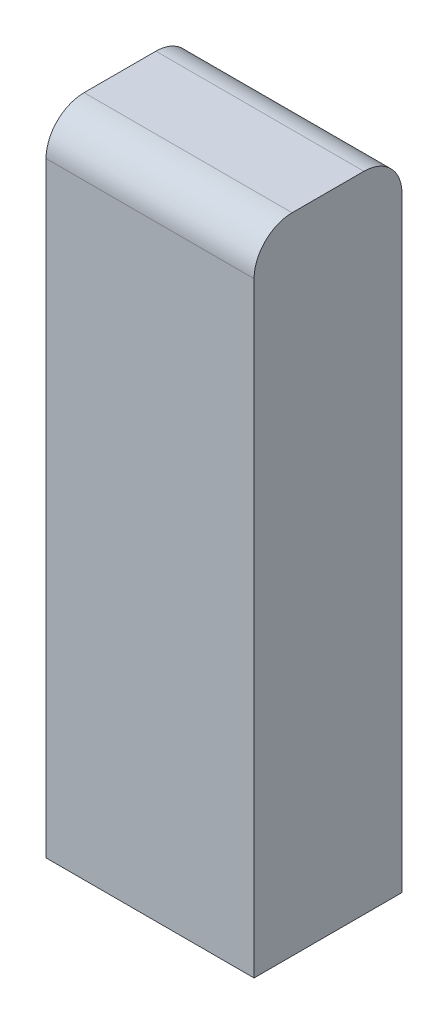
ISO-10303-21;
HEADER;
FILE_DESCRIPTION(('STEP AP214'),'2;1');
FILE_NAME('part.step','',(''),(''),'','','');
FILE_SCHEMA(('AUTOMOTIVE_DESIGN { 1 0 10303 214 1 1 1 1 }'));
ENDSEC;
DATA;
#1=APPLICATION_CONTEXT('core data for automotive mechanical design processes');
#2=APPLICATION_PROTOCOL_DEFINITION('international standard','automotive_design',2000,#1);
#3=PRODUCT_CONTEXT('',#1,'mechanical');
#4=PRODUCT('Part','Part','',(#3));
#5=PRODUCT_RELATED_PRODUCT_CATEGORY('part','',(#4));
#6=PRODUCT_DEFINITION_FORMATION('','',#4);
#7=PRODUCT_DEFINITION_CONTEXT('part definition',#1,'design');
#8=PRODUCT_DEFINITION('design','',#6,#7);
#9=PRODUCT_DEFINITION_SHAPE('','',#8);
#10=(LENGTH_UNIT() NAMED_UNIT(*) SI_UNIT(.MILLI.,.METRE.));
#11=(NAMED_UNIT(*) PLANE_ANGLE_UNIT() SI_UNIT($,.RADIAN.));
#12=(NAMED_UNIT(*) SI_UNIT($,.STERADIAN.) SOLID_ANGLE_UNIT());
#13=UNCERTAINTY_MEASURE_WITH_UNIT(LENGTH_MEASURE(1.E-05),#10,'distance_accuracy_value','');
#14=(GEOMETRIC_REPRESENTATION_CONTEXT(3) GLOBAL_UNCERTAINTY_ASSIGNED_CONTEXT((#13)) GLOBAL_UNIT_ASSIGNED_CONTEXT((#10,
#11,#12)) REPRESENTATION_CONTEXT('',''));
#15=CARTESIAN_POINT('',(0.,0.,0.));
#16=DIRECTION('',(0.,0.,1.));
#17=DIRECTION('',(1.,0.,0.));
#18=AXIS2_PLACEMENT_3D('',#15,#16,#17);
#19=CARTESIAN_POINT('',(17.3609,-53.721,24.6888));
#20=DIRECTION('',(-1.,0.,0.));
#21=DIRECTION('',(0.,0.,1.));
#22=AXIS2_PLACEMENT_3D('',#19,#20,#21);
#23=PLANE('',#22);
#24=DIRECTION('',(0.,1.,0.));
#25=VECTOR('',#24,1.);
#26=CARTESIAN_POINT('',(17.3609,-53.721,0.));
#27=LINE('',#26,#25);
#28=CARTESIAN_POINT('',(17.3609,-53.721,0.));
#29=VERTEX_POINT('',#28);
#30=CARTESIAN_POINT('',(17.3609,47.371,0.));
#31=VERTEX_POINT('',#30);
#32=EDGE_CURVE('E138',#29,#31,#27,.T.);
#33=ORIENTED_EDGE('',*,*,#32,.T.);
#34=CARTESIAN_POINT('',(17.3609,47.371,6.35));
#35=DIRECTION('',(-1.,0.,0.));
#36=DIRECTION('',(0.,0.,1.));
#37=AXIS2_PLACEMENT_3D('',#34,#35,#36);
#38=CIRCLE('',#37,6.35);
#39=CARTESIAN_POINT('',(17.3609,53.721,6.35));
#40=VERTEX_POINT('',#39);
#41=EDGE_CURVE('E60',#31,#40,#38,.F.);
#42=ORIENTED_EDGE('',*,*,#41,.T.);
#43=DIRECTION('',(0.,0.,-1.));
#44=VECTOR('',#43,1.);
#45=CARTESIAN_POINT('',(17.3609,53.721,24.6888));
#46=LINE('',#45,#44);
#47=CARTESIAN_POINT('',(17.3609,53.721,18.3388));
#48=VERTEX_POINT('',#47);
#49=EDGE_CURVE('E148',#48,#40,#46,.T.);
#50=ORIENTED_EDGE('',*,*,#49,.F.);
#51=CARTESIAN_POINT('',(17.3609,47.371,18.3388));
#52=DIRECTION('',(-1.,0.,0.));
#53=DIRECTION('',(0.,0.,1.));
#54=AXIS2_PLACEMENT_3D('',#51,#52,#53);
#55=CIRCLE('',#54,6.35);
#56=CARTESIAN_POINT('',(17.3609,47.371,24.6888));
#57=VERTEX_POINT('',#56);
#58=EDGE_CURVE('E67',#48,#57,#55,.F.);
#59=ORIENTED_EDGE('',*,*,#58,.T.);
#60=DIRECTION('',(0.,1.,0.));
#61=VECTOR('',#60,1.);
#62=CARTESIAN_POINT('',(17.3609,-53.721,24.6888));
#63=LINE('',#62,#61);
#64=CARTESIAN_POINT('',(17.3609,-53.721,24.6888));
#65=VERTEX_POINT('',#64);
#66=EDGE_CURVE('E117',#65,#57,#63,.T.);
#67=ORIENTED_EDGE('',*,*,#66,.F.);
#68=DIRECTION('',(0.,0.,-1.));
#69=VECTOR('',#68,1.);
#70=CARTESIAN_POINT('',(17.3609,-53.721,24.6888));
#71=LINE('',#70,#69);
#72=EDGE_CURVE('E128',#65,#29,#71,.T.);
#73=ORIENTED_EDGE('',*,*,#72,.T.);
#74=EDGE_LOOP('',(#33,#42,#50,#59,#67,#73));
#75=FACE_BOUND('',#74,.T.);
#76=ADVANCED_FACE('F51',(#75),#23,.F.);
#77=CARTESIAN_POINT('',(-17.3609,53.721,24.6888));
#78=DIRECTION('',(0.,-1.,0.));
#79=DIRECTION('',(0.,0.,-1.));
#80=AXIS2_PLACEMENT_3D('',#77,#78,#79);
#81=PLANE('',#80);
#82=ORIENTED_EDGE('',*,*,#49,.T.);
#83=DIRECTION('',(-1.,0.,0.));
#84=VECTOR('',#83,1.);
#85=CARTESIAN_POINT('',(-17.3609,53.721,6.35));
#86=LINE('',#85,#84);
#87=CARTESIAN_POINT('',(-17.3609,53.721,6.35));
#88=VERTEX_POINT('',#87);
#89=EDGE_CURVE('E155',#40,#88,#86,.T.);
#90=ORIENTED_EDGE('',*,*,#89,.T.);
#91=DIRECTION('',(0.,0.,-1.));
#92=VECTOR('',#91,1.);
#93=CARTESIAN_POINT('',(-17.3609,53.721,24.6888));
#94=LINE('',#93,#92);
#95=CARTESIAN_POINT('',(-17.3609,53.721,18.3388));
#96=VERTEX_POINT('',#95);
#97=EDGE_CURVE('E127',#96,#88,#94,.T.);
#98=ORIENTED_EDGE('',*,*,#97,.F.);
#99=DIRECTION('',(-1.,0.,0.));
#100=VECTOR('',#99,1.);
#101=CARTESIAN_POINT('',(-17.3609,53.721,18.3388));
#102=LINE('',#101,#100);
#103=EDGE_CURVE('E152',#96,#48,#102,.F.);
#104=ORIENTED_EDGE('',*,*,#103,.T.);
#105=EDGE_LOOP('',(#82,#90,#98,#104));
#106=FACE_BOUND('',#105,.T.);
#107=ADVANCED_FACE('F173',(#106),#81,.F.);
#108=CARTESIAN_POINT('',(-17.3609,-53.721,24.6888));
#109=DIRECTION('',(1.,0.,0.));
#110=DIRECTION('',(0.,0.,-1.));
#111=AXIS2_PLACEMENT_3D('',#108,#109,#110);
#112=PLANE('',#111);
#113=ORIENTED_EDGE('',*,*,#97,.T.);
#114=CARTESIAN_POINT('',(-17.3609,47.371,6.35));
#115=DIRECTION('',(1.,0.,0.));
#116=DIRECTION('',(0.,0.,-1.));
#117=AXIS2_PLACEMENT_3D('',#114,#115,#116);
#118=CIRCLE('',#117,6.35);
#119=CARTESIAN_POINT('',(-17.3609,47.371,0.));
#120=VERTEX_POINT('',#119);
#121=EDGE_CURVE('E162',#88,#120,#118,.F.);
#122=ORIENTED_EDGE('',*,*,#121,.T.);
#123=DIRECTION('',(0.,-1.,0.));
#124=VECTOR('',#123,1.);
#125=CARTESIAN_POINT('',(-17.3609,-53.721,0.));
#126=LINE('',#125,#124);
#127=CARTESIAN_POINT('',(-17.3609,-53.721,0.));
#128=VERTEX_POINT('',#127);
#129=EDGE_CURVE('E123',#120,#128,#126,.T.);
#130=ORIENTED_EDGE('',*,*,#129,.T.);
#131=DIRECTION('',(0.,0.,-1.));
#132=VECTOR('',#131,1.);
#133=CARTESIAN_POINT('',(-17.3609,-53.721,24.6888));
#134=LINE('',#133,#132);
#135=CARTESIAN_POINT('',(-17.3609,-53.721,24.6888));
#136=VERTEX_POINT('',#135);
#137=EDGE_CURVE('E120',#136,#128,#134,.T.);
#138=ORIENTED_EDGE('',*,*,#137,.F.);
#139=DIRECTION('',(0.,-1.,0.));
#140=VECTOR('',#139,1.);
#141=CARTESIAN_POINT('',(-17.3609,-53.721,24.6888));
#142=LINE('',#141,#140);
#143=CARTESIAN_POINT('',(-17.3609,47.371,24.6888));
#144=VERTEX_POINT('',#143);
#145=EDGE_CURVE('E108',#144,#136,#142,.T.);
#146=ORIENTED_EDGE('',*,*,#145,.F.);
#147=CARTESIAN_POINT('',(-17.3609,47.371,18.3388));
#148=DIRECTION('',(1.,0.,0.));
#149=DIRECTION('',(0.,0.,-1.));
#150=AXIS2_PLACEMENT_3D('',#147,#148,#149);
#151=CIRCLE('',#150,6.35);
#152=EDGE_CURVE('E159',#144,#96,#151,.F.);
#153=ORIENTED_EDGE('',*,*,#152,.T.);
#154=EDGE_LOOP('',(#113,#122,#130,#138,#146,#153));
#155=FACE_BOUND('',#154,.T.);
#156=ADVANCED_FACE('F122',(#155),#112,.F.);
#157=CARTESIAN_POINT('',(-17.3609,-53.721,24.6888));
#158=DIRECTION('',(0.,1.,0.));
#159=DIRECTION('',(0.,0.,1.));
#160=AXIS2_PLACEMENT_3D('',#157,#158,#159);
#161=PLANE('',#160);
#162=DIRECTION('',(1.,0.,0.));
#163=VECTOR('',#162,1.);
#164=CARTESIAN_POINT('',(-17.3609,-53.721,0.));
#165=LINE('',#164,#163);
#166=EDGE_CURVE('E143',#128,#29,#165,.T.);
#167=ORIENTED_EDGE('',*,*,#166,.T.);
#168=ORIENTED_EDGE('',*,*,#72,.F.);
#169=DIRECTION('',(1.,0.,0.));
#170=VECTOR('',#169,1.);
#171=CARTESIAN_POINT('',(-17.3609,-53.721,24.6888));
#172=LINE('',#171,#170);
#173=EDGE_CURVE('E112',#136,#65,#172,.T.);
#174=ORIENTED_EDGE('',*,*,#173,.F.);
#175=ORIENTED_EDGE('',*,*,#137,.T.);
#176=EDGE_LOOP('',(#167,#168,#174,#175));
#177=FACE_BOUND('',#176,.T.);
#178=ADVANCED_FACE('F130',(#177),#161,.F.);
#179=CARTESIAN_POINT('',(0.,0.,24.6888));
#180=DIRECTION('',(0.,0.,-1.));
#181=DIRECTION('',(-1.,0.,0.));
#182=AXIS2_PLACEMENT_3D('',#179,#180,#181);
#183=PLANE('',#182);
#184=ORIENTED_EDGE('',*,*,#66,.T.);
#185=DIRECTION('',(-1.,0.,0.));
#186=VECTOR('',#185,1.);
#187=CARTESIAN_POINT('',(0.,47.371,24.6888));
#188=LINE('',#187,#186);
#189=EDGE_CURVE('E11',#57,#144,#188,.T.);
#190=ORIENTED_EDGE('',*,*,#189,.T.);
#191=ORIENTED_EDGE('',*,*,#145,.T.);
#192=ORIENTED_EDGE('',*,*,#173,.T.);
#193=EDGE_LOOP('',(#184,#190,#191,#192));
#194=FACE_BOUND('',#193,.T.);
#195=ADVANCED_FACE('F110',(#194),#183,.F.);
#196=CARTESIAN_POINT('',(0.,0.,0.));
#197=DIRECTION('',(0.,0.,-1.));
#198=DIRECTION('',(-1.,0.,0.));
#199=AXIS2_PLACEMENT_3D('',#196,#197,#198);
#200=PLANE('',#199);
#201=ORIENTED_EDGE('',*,*,#129,.F.);
#202=DIRECTION('',(-1.,0.,0.));
#203=VECTOR('',#202,1.);
#204=CARTESIAN_POINT('',(17.3609,47.371,0.));
#205=LINE('',#204,#203);
#206=EDGE_CURVE('E75',#120,#31,#205,.F.);
#207=ORIENTED_EDGE('',*,*,#206,.T.);
#208=ORIENTED_EDGE('',*,*,#32,.F.);
#209=ORIENTED_EDGE('',*,*,#166,.F.);
#210=EDGE_LOOP('',(#201,#207,#208,#209));
#211=FACE_BOUND('',#210,.T.);
#212=ADVANCED_FACE('F177',(#211),#200,.T.);
#213=CARTESIAN_POINT('',(-17.3609,47.371,6.35));
#214=DIRECTION('',(1.,0.,0.));
#215=DIRECTION('',(0.,0.,-1.));
#216=AXIS2_PLACEMENT_3D('',#213,#214,#215);
#217=CYLINDRICAL_SURFACE('',#216,6.35);
#218=ORIENTED_EDGE('',*,*,#41,.F.);
#219=ORIENTED_EDGE('',*,*,#206,.F.);
#220=ORIENTED_EDGE('',*,*,#121,.F.);
#221=ORIENTED_EDGE('',*,*,#89,.F.);
#222=EDGE_LOOP('',(#218,#219,#220,#221));
#223=FACE_BOUND('',#222,.T.);
#224=ADVANCED_FACE('F176',(#223),#217,.T.);
#225=CARTESIAN_POINT('',(0.,47.371,18.3388));
#226=DIRECTION('',(-1.,0.,0.));
#227=DIRECTION('',(0.,0.,1.));
#228=AXIS2_PLACEMENT_3D('',#225,#226,#227);
#229=CYLINDRICAL_SURFACE('',#228,6.35);
#230=ORIENTED_EDGE('',*,*,#58,.F.);
#231=ORIENTED_EDGE('',*,*,#103,.F.);
#232=ORIENTED_EDGE('',*,*,#152,.F.);
#233=ORIENTED_EDGE('',*,*,#189,.F.);
#234=EDGE_LOOP('',(#230,#231,#232,#233));
#235=FACE_BOUND('',#234,.T.);
#236=ADVANCED_FACE('F53',(#235),#229,.T.);
#237=CLOSED_SHELL('',(#76,#107,#156,#178,#195,#212,#224,#236));
#238=MANIFOLD_SOLID_BREP('B2',#237);
#239=ADVANCED_BREP_SHAPE_REPRESENTATION('',(#18,#238),#14);
#240=SHAPE_DEFINITION_REPRESENTATION(#9,#239);
ENDSEC;
END-ISO-10303-21;
